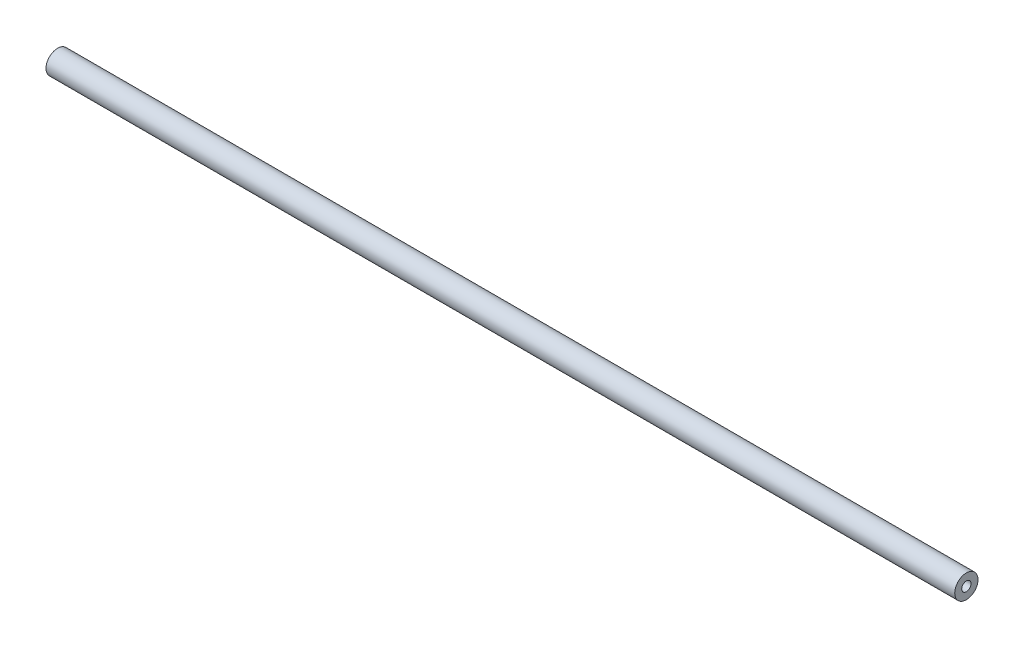
ISO-10303-21;
HEADER;
FILE_DESCRIPTION(('STEP AP214'),'2;1');
FILE_NAME('part.step','',(''),(''),'','','');
FILE_SCHEMA(('AUTOMOTIVE_DESIGN { 1 0 10303 214 1 1 1 1 }'));
ENDSEC;
DATA;
#1=APPLICATION_CONTEXT('core data for automotive mechanical design processes');
#2=APPLICATION_PROTOCOL_DEFINITION('international standard','automotive_design',2000,#1);
#3=PRODUCT_CONTEXT('',#1,'mechanical');
#4=PRODUCT('Part','Part','',(#3));
#5=PRODUCT_RELATED_PRODUCT_CATEGORY('part','',(#4));
#6=PRODUCT_DEFINITION_FORMATION('','',#4);
#7=PRODUCT_DEFINITION_CONTEXT('part definition',#1,'design');
#8=PRODUCT_DEFINITION('design','',#6,#7);
#9=PRODUCT_DEFINITION_SHAPE('','',#8);
#10=(LENGTH_UNIT() NAMED_UNIT(*) SI_UNIT(.MILLI.,.METRE.));
#11=(NAMED_UNIT(*) PLANE_ANGLE_UNIT() SI_UNIT($,.RADIAN.));
#12=(NAMED_UNIT(*) SI_UNIT($,.STERADIAN.) SOLID_ANGLE_UNIT());
#13=UNCERTAINTY_MEASURE_WITH_UNIT(LENGTH_MEASURE(1.E-05),#10,'distance_accuracy_value','');
#14=(GEOMETRIC_REPRESENTATION_CONTEXT(3) GLOBAL_UNCERTAINTY_ASSIGNED_CONTEXT((#13)) GLOBAL_UNIT_ASSIGNED_CONTEXT((#10,
#11,#12)) REPRESENTATION_CONTEXT('',''));
#15=CARTESIAN_POINT('',(0.,0.,0.));
#16=DIRECTION('',(0.,0.,1.));
#17=DIRECTION('',(1.,0.,0.));
#18=AXIS2_PLACEMENT_3D('',#15,#16,#17);
#19=CARTESIAN_POINT('',(367.999999999995,0.,0.));
#20=DIRECTION('',(1.,0.,0.));
#21=DIRECTION('',(0.,0.,-1.));
#22=AXIS2_PLACEMENT_3D('',#19,#20,#21);
#23=CONICAL_SURFACE('',#22,3.49999999991724,1.02974425863797);
#24=CARTESIAN_POINT('',(365.896987833395,0.,5.6843418860808E-11));
#25=VERTEX_POINT('',#24);
#26=VERTEX_LOOP('',#25);
#27=FACE_BOUND('',#26,.T.);
#28=CARTESIAN_POINT('',(368.,0.,0.));
#29=DIRECTION('',(1.,0.,0.));
#30=DIRECTION('',(0.,0.,-1.));
#31=AXIS2_PLACEMENT_3D('',#28,#29,#30);
#32=CIRCLE('',#31,3.5);
#33=CARTESIAN_POINT('',(368.,0.,-3.5));
#34=VERTEX_POINT('',#33);
#35=EDGE_CURVE('E37',#34,#34,#32,.T.);
#36=ORIENTED_EDGE('',*,*,#35,.T.);
#37=EDGE_LOOP('',(#36));
#38=FACE_BOUND('',#37,.T.);
#39=ADVANCED_FACE('F17',(#27,#38),#23,.F.);
#40=CARTESIAN_POINT('',(-367.999999999995,0.,0.));
#41=DIRECTION('',(-1.,0.,0.));
#42=DIRECTION('',(0.,0.,1.));
#43=AXIS2_PLACEMENT_3D('',#40,#41,#42);
#44=CONICAL_SURFACE('',#43,3.49999999991724,1.02974425863797);
#45=CARTESIAN_POINT('',(-365.896987833395,0.,-5.6843418860808E-11));
#46=VERTEX_POINT('',#45);
#47=VERTEX_LOOP('',#46);
#48=FACE_BOUND('',#47,.T.);
#49=CARTESIAN_POINT('',(-368.,0.,0.));
#50=DIRECTION('',(-1.,0.,0.));
#51=DIRECTION('',(0.,0.,1.));
#52=AXIS2_PLACEMENT_3D('',#49,#50,#51);
#53=CIRCLE('',#52,3.5);
#54=CARTESIAN_POINT('',(-368.,0.,3.5));
#55=VERTEX_POINT('',#54);
#56=EDGE_CURVE('E39',#55,#55,#53,.T.);
#57=ORIENTED_EDGE('',*,*,#56,.T.);
#58=EDGE_LOOP('',(#57));
#59=FACE_BOUND('',#58,.T.);
#60=ADVANCED_FACE('F34',(#48,#59),#44,.F.);
#61=CARTESIAN_POINT('',(390.,0.,0.));
#62=DIRECTION('',(1.,0.,0.));
#63=DIRECTION('',(0.,0.,-1.));
#64=AXIS2_PLACEMENT_3D('',#61,#62,#63);
#65=CYLINDRICAL_SURFACE('',#64,3.5);
#66=ORIENTED_EDGE('',*,*,#35,.F.);
#67=EDGE_LOOP('',(#66));
#68=FACE_BOUND('',#67,.T.);
#69=CARTESIAN_POINT('',(372.,0.,0.));
#70=DIRECTION('',(1.,0.,0.));
#71=DIRECTION('',(0.,0.,-1.));
#72=AXIS2_PLACEMENT_3D('',#69,#70,#71);
#73=CIRCLE('',#72,3.5);
#74=CARTESIAN_POINT('',(372.,0.,-3.5));
#75=VERTEX_POINT('',#74);
#76=EDGE_CURVE('E20',#75,#75,#73,.T.);
#77=ORIENTED_EDGE('',*,*,#76,.T.);
#78=EDGE_LOOP('',(#77));
#79=FACE_BOUND('',#78,.T.);
#80=ADVANCED_FACE('F64',(#68,#79),#65,.F.);
#81=CARTESIAN_POINT('',(-390.,0.,0.));
#82=DIRECTION('',(-1.,0.,0.));
#83=DIRECTION('',(0.,0.,1.));
#84=AXIS2_PLACEMENT_3D('',#81,#82,#83);
#85=CYLINDRICAL_SURFACE('',#84,3.5);
#86=ORIENTED_EDGE('',*,*,#56,.F.);
#87=EDGE_LOOP('',(#86));
#88=FACE_BOUND('',#87,.T.);
#89=CARTESIAN_POINT('',(-372.,0.,0.));
#90=DIRECTION('',(-1.,0.,0.));
#91=DIRECTION('',(0.,0.,1.));
#92=AXIS2_PLACEMENT_3D('',#89,#90,#91);
#93=CIRCLE('',#92,3.5);
#94=CARTESIAN_POINT('',(-372.,0.,3.5));
#95=VERTEX_POINT('',#94);
#96=EDGE_CURVE('E57',#95,#95,#93,.T.);
#97=ORIENTED_EDGE('',*,*,#96,.T.);
#98=EDGE_LOOP('',(#97));
#99=FACE_BOUND('',#98,.T.);
#100=ADVANCED_FACE('F69',(#88,#99),#85,.F.);
#101=CARTESIAN_POINT('',(372.,3.5,0.));
#102=DIRECTION('',(-1.,0.,0.));
#103=DIRECTION('',(0.,0.,1.));
#104=AXIS2_PLACEMENT_3D('',#101,#102,#103);
#105=PLANE('',#104);
#106=CARTESIAN_POINT('',(372.,0.,0.));
#107=DIRECTION('',(1.,0.,0.));
#108=DIRECTION('',(0.,0.,-1.));
#109=AXIS2_PLACEMENT_3D('',#106,#107,#108);
#110=CIRCLE('',#109,4.);
#111=CARTESIAN_POINT('',(372.,0.,-4.));
#112=VERTEX_POINT('',#111);
#113=EDGE_CURVE('E55',#112,#112,#110,.T.);
#114=ORIENTED_EDGE('',*,*,#113,.T.);
#115=EDGE_LOOP('',(#114));
#116=FACE_BOUND('',#115,.T.);
#117=ORIENTED_EDGE('',*,*,#76,.F.);
#118=EDGE_LOOP('',(#117));
#119=FACE_BOUND('',#118,.T.);
#120=ADVANCED_FACE('F66',(#116,#119),#105,.F.);
#121=CARTESIAN_POINT('',(-372.,3.5,0.));
#122=DIRECTION('',(1.,0.,0.));
#123=DIRECTION('',(0.,0.,-1.));
#124=AXIS2_PLACEMENT_3D('',#121,#122,#123);
#125=PLANE('',#124);
#126=CARTESIAN_POINT('',(-372.,0.,0.));
#127=DIRECTION('',(-1.,0.,0.));
#128=DIRECTION('',(0.,0.,1.));
#129=AXIS2_PLACEMENT_3D('',#126,#127,#128);
#130=CIRCLE('',#129,4.);
#131=CARTESIAN_POINT('',(-372.,0.,4.));
#132=VERTEX_POINT('',#131);
#133=EDGE_CURVE('E52',#132,#132,#130,.T.);
#134=ORIENTED_EDGE('',*,*,#133,.T.);
#135=EDGE_LOOP('',(#134));
#136=FACE_BOUND('',#135,.T.);
#137=ORIENTED_EDGE('',*,*,#96,.F.);
#138=EDGE_LOOP('',(#137));
#139=FACE_BOUND('',#138,.T.);
#140=ADVANCED_FACE('F68',(#136,#139),#125,.F.);
#141=CARTESIAN_POINT('',(390.,0.,0.));
#142=DIRECTION('',(1.,0.,0.));
#143=DIRECTION('',(0.,0.,-1.));
#144=AXIS2_PLACEMENT_3D('',#141,#142,#143);
#145=CYLINDRICAL_SURFACE('',#144,4.);
#146=CARTESIAN_POINT('',(390.,0.,0.));
#147=DIRECTION('',(1.,0.,0.));
#148=DIRECTION('',(0.,0.,-1.));
#149=AXIS2_PLACEMENT_3D('',#146,#147,#148);
#150=CIRCLE('',#149,4.);
#151=CARTESIAN_POINT('',(390.,0.,-4.));
#152=VERTEX_POINT('',#151);
#153=EDGE_CURVE('E49',#152,#152,#150,.F.);
#154=ORIENTED_EDGE('',*,*,#153,.F.);
#155=EDGE_LOOP('',(#154));
#156=FACE_BOUND('',#155,.T.);
#157=ORIENTED_EDGE('',*,*,#113,.F.);
#158=EDGE_LOOP('',(#157));
#159=FACE_BOUND('',#158,.T.);
#160=ADVANCED_FACE('F77',(#156,#159),#145,.F.);
#161=CARTESIAN_POINT('',(-390.,0.,0.));
#162=DIRECTION('',(-1.,0.,0.));
#163=DIRECTION('',(0.,0.,1.));
#164=AXIS2_PLACEMENT_3D('',#161,#162,#163);
#165=CYLINDRICAL_SURFACE('',#164,4.);
#166=ORIENTED_EDGE('',*,*,#133,.F.);
#167=EDGE_LOOP('',(#166));
#168=FACE_BOUND('',#167,.T.);
#169=CARTESIAN_POINT('',(-390.,0.,0.));
#170=DIRECTION('',(-1.,0.,0.));
#171=DIRECTION('',(0.,0.,1.));
#172=AXIS2_PLACEMENT_3D('',#169,#170,#171);
#173=CIRCLE('',#172,4.);
#174=CARTESIAN_POINT('',(-390.,0.,4.));
#175=VERTEX_POINT('',#174);
#176=EDGE_CURVE('E46',#175,#175,#173,.T.);
#177=ORIENTED_EDGE('',*,*,#176,.T.);
#178=EDGE_LOOP('',(#177));
#179=FACE_BOUND('',#178,.T.);
#180=ADVANCED_FACE('F97',(#168,#179),#165,.F.);
#181=CARTESIAN_POINT('',(390.,0.,0.));
#182=DIRECTION('',(1.,0.,0.));
#183=DIRECTION('',(0.,0.,-1.));
#184=AXIS2_PLACEMENT_3D('',#181,#182,#183);
#185=PLANE('',#184);
#186=CARTESIAN_POINT('',(390.,0.,0.));
#187=DIRECTION('',(-1.,0.,0.));
#188=DIRECTION('',(0.,0.,1.));
#189=AXIS2_PLACEMENT_3D('',#186,#187,#188);
#190=CIRCLE('',#189,10.);
#191=CARTESIAN_POINT('',(390.,0.,10.));
#192=VERTEX_POINT('',#191);
#193=EDGE_CURVE('E26',#192,#192,#190,.T.);
#194=ORIENTED_EDGE('',*,*,#193,.F.);
#195=EDGE_LOOP('',(#194));
#196=FACE_BOUND('',#195,.T.);
#197=ORIENTED_EDGE('',*,*,#153,.T.);
#198=EDGE_LOOP('',(#197));
#199=FACE_BOUND('',#198,.T.);
#200=ADVANCED_FACE('F90',(#196,#199),#185,.T.);
#201=CARTESIAN_POINT('',(-390.,0.,0.));
#202=DIRECTION('',(1.,0.,0.));
#203=DIRECTION('',(0.,0.,-1.));
#204=AXIS2_PLACEMENT_3D('',#201,#202,#203);
#205=PLANE('',#204);
#206=CARTESIAN_POINT('',(-390.,0.,0.));
#207=DIRECTION('',(-1.,0.,0.));
#208=DIRECTION('',(0.,0.,1.));
#209=AXIS2_PLACEMENT_3D('',#206,#207,#208);
#210=CIRCLE('',#209,10.);
#211=CARTESIAN_POINT('',(-390.,0.,10.));
#212=VERTEX_POINT('',#211);
#213=EDGE_CURVE('E11',#212,#212,#210,.F.);
#214=ORIENTED_EDGE('',*,*,#213,.F.);
#215=EDGE_LOOP('',(#214));
#216=FACE_BOUND('',#215,.T.);
#217=ORIENTED_EDGE('',*,*,#176,.F.);
#218=EDGE_LOOP('',(#217));
#219=FACE_BOUND('',#218,.T.);
#220=ADVANCED_FACE('F84',(#216,#219),#205,.F.);
#221=CARTESIAN_POINT('',(390.,0.,0.));
#222=DIRECTION('',(-1.,0.,0.));
#223=DIRECTION('',(0.,0.,1.));
#224=AXIS2_PLACEMENT_3D('',#221,#222,#223);
#225=CYLINDRICAL_SURFACE('',#224,10.);
#226=ORIENTED_EDGE('',*,*,#213,.T.);
#227=EDGE_LOOP('',(#226));
#228=FACE_BOUND('',#227,.T.);
#229=ORIENTED_EDGE('',*,*,#193,.T.);
#230=EDGE_LOOP('',(#229));
#231=FACE_BOUND('',#230,.T.);
#232=ADVANCED_FACE('F82',(#228,#231),#225,.T.);
#233=CLOSED_SHELL('',(#39,#60,#80,#100,#120,#140,#160,#180,#200,#220,#232));
#234=MANIFOLD_SOLID_BREP('B1',#233);
#235=ADVANCED_BREP_SHAPE_REPRESENTATION('',(#18,#234),#14);
#236=SHAPE_DEFINITION_REPRESENTATION(#9,#235);
ENDSEC;
END-ISO-10303-21;
